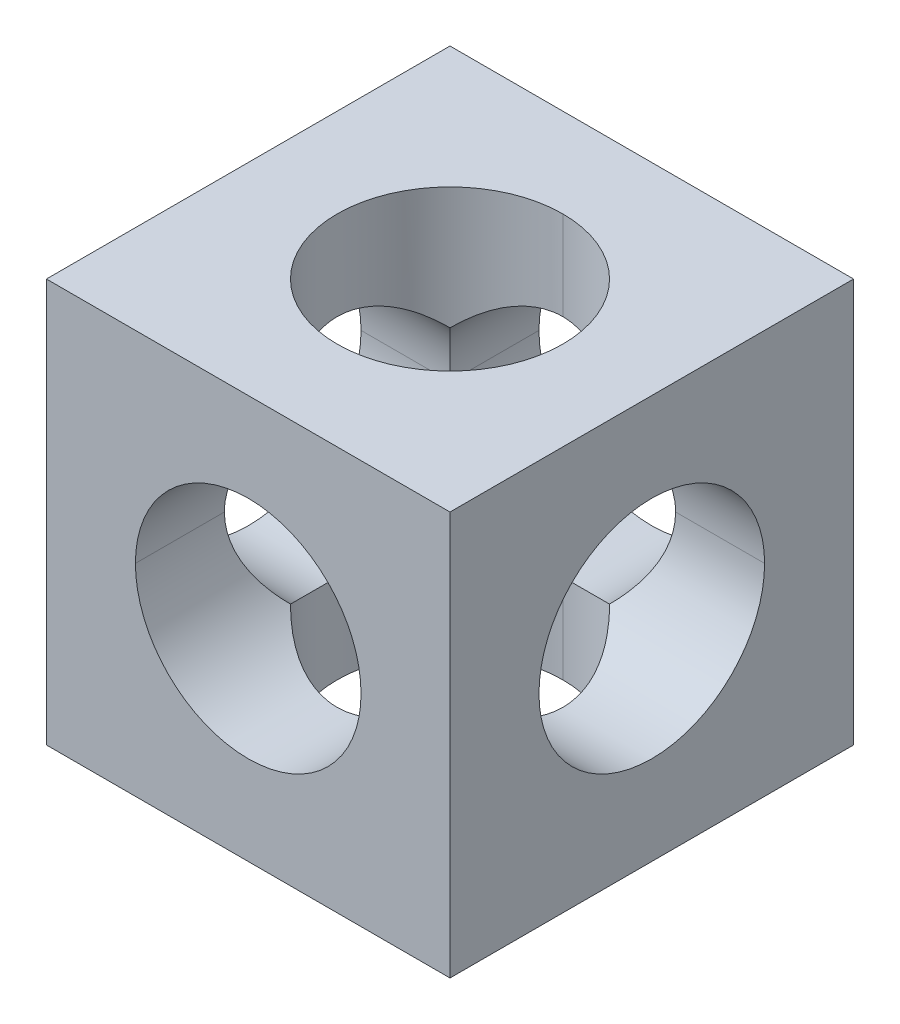
ISO-10303-21;
HEADER;
FILE_DESCRIPTION(('STEP AP214'),'2;1');
FILE_NAME('part.step','',(''),(''),'','','');
FILE_SCHEMA(('AUTOMOTIVE_DESIGN { 1 0 10303 214 1 1 1 1 }'));
ENDSEC;
DATA;
#1=APPLICATION_CONTEXT('core data for automotive mechanical design processes');
#2=APPLICATION_PROTOCOL_DEFINITION('international standard','automotive_design',2000,#1);
#3=PRODUCT_CONTEXT('',#1,'mechanical');
#4=PRODUCT('Part','Part','',(#3));
#5=PRODUCT_RELATED_PRODUCT_CATEGORY('part','',(#4));
#6=PRODUCT_DEFINITION_FORMATION('','',#4);
#7=PRODUCT_DEFINITION_CONTEXT('part definition',#1,'design');
#8=PRODUCT_DEFINITION('design','',#6,#7);
#9=PRODUCT_DEFINITION_SHAPE('','',#8);
#10=(LENGTH_UNIT() NAMED_UNIT(*) SI_UNIT(.MILLI.,.METRE.));
#11=(NAMED_UNIT(*) PLANE_ANGLE_UNIT() SI_UNIT($,.RADIAN.));
#12=(NAMED_UNIT(*) SI_UNIT($,.STERADIAN.) SOLID_ANGLE_UNIT());
#13=UNCERTAINTY_MEASURE_WITH_UNIT(LENGTH_MEASURE(1.E-05),#10,'distance_accuracy_value','');
#14=(GEOMETRIC_REPRESENTATION_CONTEXT(3) GLOBAL_UNCERTAINTY_ASSIGNED_CONTEXT((#13)) GLOBAL_UNIT_ASSIGNED_CONTEXT((#10,
#11,#12)) REPRESENTATION_CONTEXT('',''));
#15=CARTESIAN_POINT('',(0.,0.,0.));
#16=DIRECTION('',(0.,0.,1.));
#17=DIRECTION('',(1.,0.,0.));
#18=AXIS2_PLACEMENT_3D('',#15,#16,#17);
#19=CARTESIAN_POINT('',(6.35,6.35,-12.7));
#20=DIRECTION('',(0.,0.,1.));
#21=DIRECTION('',(1.,0.,0.));
#22=AXIS2_PLACEMENT_3D('',#19,#20,#21);
#23=CYLINDRICAL_SURFACE('',#22,3.55);
#24=DIRECTION('',(0.,0.,1.));
#25=VECTOR('',#24,1.);
#26=CARTESIAN_POINT('',(2.8,6.35,-12.7));
#27=LINE('',#26,#25);
#28=CARTESIAN_POINT('',(2.8,6.35,-2.8));
#29=VERTEX_POINT('',#28);
#30=CARTESIAN_POINT('',(2.8,6.35,0.));
#31=VERTEX_POINT('',#30);
#32=EDGE_CURVE('E241',#29,#31,#27,.T.);
#33=ORIENTED_EDGE('',*,*,#32,.F.);
#34=CARTESIAN_POINT('',(3.83977092678775,8.86022907321224,-3.83977092678775));
#35=CARTESIAN_POINT('',(3.16511899463641,8.18557714106089,-3.16511899463641));
#36=CARTESIAN_POINT('',(2.80000000000001,7.30410191232965,-2.80000000000001));
#37=CARTESIAN_POINT('',(2.8,6.35,-2.8));
#38=(BOUNDED_CURVE() B_SPLINE_CURVE(3,(#34,#35,#36,#37),.UNSPECIFIED.,.F.,
.F.) B_SPLINE_CURVE_WITH_KNOTS((4,4),(2.35619449019234,3.1415926535898),
.UNSPECIFIED.) CURVE() GEOMETRIC_REPRESENTATION_ITEM() RATIONAL_B_SPLINE_CURVE((1.,
0.949253021674191,0.949253021674191,1.)) REPRESENTATION_ITEM(''));
#39=CARTESIAN_POINT('',(3.83977092678775,8.86022907321224,-3.83977092678775));
#40=VERTEX_POINT('',#39);
#41=EDGE_CURVE('E10',#40,#29,#38,.T.);
#42=ORIENTED_EDGE('',*,*,#41,.F.);
#43=CARTESIAN_POINT('',(6.35,9.9,-2.8));
#44=CARTESIAN_POINT('',(5.39589808767035,9.9,-2.8));
#45=CARTESIAN_POINT('',(4.5144228589391,9.53488100536359,-3.16511899463641));
#46=CARTESIAN_POINT('',(3.83977092678775,8.86022907321224,-3.83977092678775));
#47=(BOUNDED_CURVE() B_SPLINE_CURVE(3,(#43,#44,#45,#46),.UNSPECIFIED.,.F.,
.F.) B_SPLINE_CURVE_WITH_KNOTS((4,4),(0.,0.785398163397449),
.UNSPECIFIED.) CURVE() GEOMETRIC_REPRESENTATION_ITEM() RATIONAL_B_SPLINE_CURVE((1.,
0.949253021674191,0.949253021674191,1.)) REPRESENTATION_ITEM(''));
#48=CARTESIAN_POINT('',(6.35,9.9,-2.8));
#49=VERTEX_POINT('',#48);
#50=EDGE_CURVE('E323',#49,#40,#47,.T.);
#51=ORIENTED_EDGE('',*,*,#50,.F.);
#52=CARTESIAN_POINT('',(8.86022907321224,8.86022907321224,-3.83977092678775));
#53=CARTESIAN_POINT('',(8.18557714106089,9.53488100536359,-3.1651189946364));
#54=CARTESIAN_POINT('',(7.30410191232965,9.9,-2.8));
#55=CARTESIAN_POINT('',(6.35,9.9,-2.8));
#56=(BOUNDED_CURVE() B_SPLINE_CURVE(3,(#52,#53,#54,#55),.UNSPECIFIED.,.F.,
.F.) B_SPLINE_CURVE_WITH_KNOTS((4,4),(5.49778714378214,6.28318530717959),
.UNSPECIFIED.) CURVE() GEOMETRIC_REPRESENTATION_ITEM() RATIONAL_B_SPLINE_CURVE((1.,
0.949253021674191,0.949253021674191,1.)) REPRESENTATION_ITEM(''));
#57=CARTESIAN_POINT('',(8.86022907321224,8.86022907321224,-3.83977092678775));
#58=VERTEX_POINT('',#57);
#59=EDGE_CURVE('E271',#58,#49,#56,.T.);
#60=ORIENTED_EDGE('',*,*,#59,.F.);
#61=CARTESIAN_POINT('',(9.9,6.35,-2.8));
#62=CARTESIAN_POINT('',(9.9,7.30410191232965,-2.80000000000001));
#63=CARTESIAN_POINT('',(9.53488100536359,8.18557714106089,-3.16511899463641));
#64=CARTESIAN_POINT('',(8.86022907321224,8.86022907321224,-3.83977092678775));
#65=(BOUNDED_CURVE() B_SPLINE_CURVE(3,(#61,#62,#63,#64),.UNSPECIFIED.,.F.,
.F.) B_SPLINE_CURVE_WITH_KNOTS((4,4),(0.,0.785398163397449),
.UNSPECIFIED.) CURVE() GEOMETRIC_REPRESENTATION_ITEM() RATIONAL_B_SPLINE_CURVE((1.,
0.949253021674191,0.949253021674191,1.)) REPRESENTATION_ITEM(''));
#66=CARTESIAN_POINT('',(9.9,6.35,-2.8));
#67=VERTEX_POINT('',#66);
#68=EDGE_CURVE('E281',#67,#58,#65,.T.);
#69=ORIENTED_EDGE('',*,*,#68,.F.);
#70=DIRECTION('',(0.,0.,1.));
#71=VECTOR('',#70,1.);
#72=CARTESIAN_POINT('',(9.9,6.35,-12.7));
#73=LINE('',#72,#71);
#74=CARTESIAN_POINT('',(9.9,6.35,0.));
#75=VERTEX_POINT('',#74);
#76=EDGE_CURVE('E389',#67,#75,#73,.T.);
#77=ORIENTED_EDGE('',*,*,#76,.T.);
#78=CARTESIAN_POINT('',(6.35,6.35,0.));
#79=DIRECTION('',(0.,0.,1.));
#80=DIRECTION('',(1.,0.,0.));
#81=AXIS2_PLACEMENT_3D('',#78,#79,#80);
#82=CIRCLE('',#81,3.55);
#83=EDGE_CURVE('E361',#75,#31,#82,.T.);
#84=ORIENTED_EDGE('',*,*,#83,.T.);
#85=EDGE_LOOP('',(#33,#42,#51,#60,#69,#77,#84));
#86=FACE_BOUND('',#85,.T.);
#87=ADVANCED_FACE('F15',(#86),#23,.F.);
#88=CARTESIAN_POINT('',(6.35,6.35,-12.7));
#89=DIRECTION('',(0.,0.,1.));
#90=DIRECTION('',(1.,0.,0.));
#91=AXIS2_PLACEMENT_3D('',#88,#89,#90);
#92=CYLINDRICAL_SURFACE('',#91,3.55);
#93=DIRECTION('',(0.,0.,1.));
#94=VECTOR('',#93,1.);
#95=CARTESIAN_POINT('',(2.8,6.35,-12.7));
#96=LINE('',#95,#94);
#97=CARTESIAN_POINT('',(2.8,6.35,-12.7));
#98=VERTEX_POINT('',#97);
#99=CARTESIAN_POINT('',(2.8,6.35,-9.9));
#100=VERTEX_POINT('',#99);
#101=EDGE_CURVE('E354',#98,#100,#96,.T.);
#102=ORIENTED_EDGE('',*,*,#101,.F.);
#103=CARTESIAN_POINT('',(6.35,6.35,-12.7));
#104=DIRECTION('',(0.,0.,1.));
#105=DIRECTION('',(1.,0.,0.));
#106=AXIS2_PLACEMENT_3D('',#103,#104,#105);
#107=CIRCLE('',#106,3.55);
#108=CARTESIAN_POINT('',(9.9,6.35,-12.7));
#109=VERTEX_POINT('',#108);
#110=EDGE_CURVE('E127',#109,#98,#107,.T.);
#111=ORIENTED_EDGE('',*,*,#110,.F.);
#112=DIRECTION('',(0.,0.,1.));
#113=VECTOR('',#112,1.);
#114=CARTESIAN_POINT('',(9.9,6.35,-12.7));
#115=LINE('',#114,#113);
#116=CARTESIAN_POINT('',(9.9,6.35,-9.9));
#117=VERTEX_POINT('',#116);
#118=EDGE_CURVE('E320',#109,#117,#115,.T.);
#119=ORIENTED_EDGE('',*,*,#118,.T.);
#120=CARTESIAN_POINT('',(8.86022907321224,8.86022907321224,-8.86022907321224));
#121=CARTESIAN_POINT('',(9.53488100536359,8.18557714106089,-9.53488100536359));
#122=CARTESIAN_POINT('',(9.9,7.30410191232965,-9.9));
#123=CARTESIAN_POINT('',(9.9,6.35,-9.9));
#124=(BOUNDED_CURVE() B_SPLINE_CURVE(3,(#120,#121,#122,#123),.UNSPECIFIED.,.F.,
.F.) B_SPLINE_CURVE_WITH_KNOTS((4,4),(5.49778714378214,6.28318530717959),
.UNSPECIFIED.) CURVE() GEOMETRIC_REPRESENTATION_ITEM() RATIONAL_B_SPLINE_CURVE((1.,
0.949253021674191,0.949253021674191,1.)) REPRESENTATION_ITEM(''));
#125=CARTESIAN_POINT('',(8.86022907321224,8.86022907321224,-8.86022907321224));
#126=VERTEX_POINT('',#125);
#127=EDGE_CURVE('E273',#126,#117,#124,.T.);
#128=ORIENTED_EDGE('',*,*,#127,.F.);
#129=CARTESIAN_POINT('',(6.35,9.9,-9.9));
#130=CARTESIAN_POINT('',(7.30410191232965,9.9,-9.9));
#131=CARTESIAN_POINT('',(8.18557714106089,9.53488100536359,-9.53488100536359));
#132=CARTESIAN_POINT('',(8.86022907321224,8.86022907321224,-8.86022907321224));
#133=(BOUNDED_CURVE() B_SPLINE_CURVE(3,(#129,#130,#131,#132),.UNSPECIFIED.,.F.,
.F.) B_SPLINE_CURVE_WITH_KNOTS((4,4),(0.,0.785398163397449),
.UNSPECIFIED.) CURVE() GEOMETRIC_REPRESENTATION_ITEM() RATIONAL_B_SPLINE_CURVE((1.,
0.949253021674191,0.949253021674191,1.)) REPRESENTATION_ITEM(''));
#134=CARTESIAN_POINT('',(6.35,9.9,-9.9));
#135=VERTEX_POINT('',#134);
#136=EDGE_CURVE('E272',#135,#126,#133,.T.);
#137=ORIENTED_EDGE('',*,*,#136,.F.);
#138=CARTESIAN_POINT('',(3.83977092678776,8.86022907321224,-8.86022907321225));
#139=CARTESIAN_POINT('',(4.51442285893911,9.53488100536359,-9.53488100536359));
#140=CARTESIAN_POINT('',(5.39589808767035,9.9,-9.9));
#141=CARTESIAN_POINT('',(6.35,9.9,-9.9));
#142=(BOUNDED_CURVE() B_SPLINE_CURVE(3,(#138,#139,#140,#141),.UNSPECIFIED.,.F.,
.F.) B_SPLINE_CURVE_WITH_KNOTS((4,4),(5.49778714378214,6.28318530717959),
.UNSPECIFIED.) CURVE() GEOMETRIC_REPRESENTATION_ITEM() RATIONAL_B_SPLINE_CURVE((1.,
0.949253021674191,0.949253021674191,1.)) REPRESENTATION_ITEM(''));
#143=CARTESIAN_POINT('',(3.83977092678776,8.86022907321224,-8.86022907321225));
#144=VERTEX_POINT('',#143);
#145=EDGE_CURVE('E295',#144,#135,#142,.T.);
#146=ORIENTED_EDGE('',*,*,#145,.F.);
#147=CARTESIAN_POINT('',(2.8,6.35,-9.9));
#148=CARTESIAN_POINT('',(2.80000000000001,7.30410191232965,-9.9));
#149=CARTESIAN_POINT('',(3.16511899463641,8.18557714106089,-9.53488100536359));
#150=CARTESIAN_POINT('',(3.83977092678776,8.86022907321224,-8.86022907321225));
#151=(BOUNDED_CURVE() B_SPLINE_CURVE(3,(#147,#148,#149,#150),.UNSPECIFIED.,.F.,
.F.) B_SPLINE_CURVE_WITH_KNOTS((4,4),(3.1415926535898,3.92699081698724),
.UNSPECIFIED.) CURVE() GEOMETRIC_REPRESENTATION_ITEM() RATIONAL_B_SPLINE_CURVE((1.,
0.949253021674191,0.949253021674191,1.)) REPRESENTATION_ITEM(''));
#152=EDGE_CURVE('E26',#100,#144,#151,.T.);
#153=ORIENTED_EDGE('',*,*,#152,.F.);
#154=EDGE_LOOP('',(#102,#111,#119,#128,#137,#146,#153));
#155=FACE_BOUND('',#154,.T.);
#156=ADVANCED_FACE('F17',(#155),#92,.F.);
#157=CARTESIAN_POINT('',(0.,6.35,-6.35));
#158=DIRECTION('',(1.,0.,0.));
#159=DIRECTION('',(0.,0.,-1.));
#160=AXIS2_PLACEMENT_3D('',#157,#158,#159);
#161=CYLINDRICAL_SURFACE('',#160,3.55);
#162=DIRECTION('',(1.,0.,0.));
#163=VECTOR('',#162,1.);
#164=CARTESIAN_POINT('',(0.,6.35,-2.8));
#165=LINE('',#164,#163);
#166=CARTESIAN_POINT('',(0.,6.35,-2.8));
#167=VERTEX_POINT('',#166);
#168=EDGE_CURVE('E223',#167,#29,#165,.T.);
#169=ORIENTED_EDGE('',*,*,#168,.F.);
#170=CARTESIAN_POINT('',(0.,6.35,-6.35));
#171=DIRECTION('',(1.,0.,0.));
#172=DIRECTION('',(0.,0.,-1.));
#173=AXIS2_PLACEMENT_3D('',#170,#171,#172);
#174=CIRCLE('',#173,3.55);
#175=CARTESIAN_POINT('',(0.,6.35,-9.9));
#176=VERTEX_POINT('',#175);
#177=EDGE_CURVE('E318',#176,#167,#174,.T.);
#178=ORIENTED_EDGE('',*,*,#177,.F.);
#179=DIRECTION('',(1.,0.,0.));
#180=VECTOR('',#179,1.);
#181=CARTESIAN_POINT('',(0.,6.35,-9.9));
#182=LINE('',#181,#180);
#183=EDGE_CURVE('E222',#176,#100,#182,.T.);
#184=ORIENTED_EDGE('',*,*,#183,.T.);
#185=ORIENTED_EDGE('',*,*,#152,.T.);
#186=CARTESIAN_POINT('',(3.83977092678775,8.86022907321224,-3.83977092678775));
#187=CARTESIAN_POINT('',(2.36931278036327,10.3306872196367,-5.31022907321224));
#188=CARTESIAN_POINT('',(2.36931278036327,10.3306872196367,-7.38977092678776));
#189=CARTESIAN_POINT('',(3.83977092678776,8.86022907321224,-8.86022907321225));
#190=(BOUNDED_CURVE() B_SPLINE_CURVE(3,(#186,#187,#188,#189),.UNSPECIFIED.,.F.,
.F.) B_SPLINE_CURVE_WITH_KNOTS((4,4),(5.49778714378214,7.06858347057704),
.UNSPECIFIED.) CURVE() GEOMETRIC_REPRESENTATION_ITEM() RATIONAL_B_SPLINE_CURVE((1.,
0.804737854124365,0.804737854124365,1.)) REPRESENTATION_ITEM(''));
#191=EDGE_CURVE('E329',#40,#144,#190,.T.);
#192=ORIENTED_EDGE('',*,*,#191,.F.);
#193=ORIENTED_EDGE('',*,*,#41,.T.);
#194=EDGE_LOOP('',(#169,#178,#184,#185,#192,#193));
#195=FACE_BOUND('',#194,.T.);
#196=ADVANCED_FACE('F525',(#195),#161,.F.);
#197=CARTESIAN_POINT('',(0.,6.35,-6.35));
#198=DIRECTION('',(1.,0.,0.));
#199=DIRECTION('',(0.,0.,-1.));
#200=AXIS2_PLACEMENT_3D('',#197,#198,#199);
#201=CYLINDRICAL_SURFACE('',#200,3.55);
#202=DIRECTION('',(1.,0.,0.));
#203=VECTOR('',#202,1.);
#204=CARTESIAN_POINT('',(0.,6.35,-2.8));
#205=LINE('',#204,#203);
#206=CARTESIAN_POINT('',(12.7,6.35,-2.8));
#207=VERTEX_POINT('',#206);
#208=EDGE_CURVE('E282',#67,#207,#205,.T.);
#209=ORIENTED_EDGE('',*,*,#208,.F.);
#210=ORIENTED_EDGE('',*,*,#68,.T.);
#211=CARTESIAN_POINT('',(8.86022907321224,8.86022907321224,-8.86022907321224));
#212=CARTESIAN_POINT('',(10.3306872196367,10.3306872196367,-7.38977092678776));
#213=CARTESIAN_POINT('',(10.3306872196367,10.3306872196367,-5.31022907321224));
#214=CARTESIAN_POINT('',(8.86022907321224,8.86022907321224,-3.83977092678775));
#215=(BOUNDED_CURVE() B_SPLINE_CURVE(3,(#211,#212,#213,#214),.UNSPECIFIED.,.F.,
.F.) B_SPLINE_CURVE_WITH_KNOTS((4,4),(5.49778714378214,7.06858347057704),
.UNSPECIFIED.) CURVE() GEOMETRIC_REPRESENTATION_ITEM() RATIONAL_B_SPLINE_CURVE((1.,
0.804737854124365,0.804737854124365,1.)) REPRESENTATION_ITEM(''));
#216=EDGE_CURVE('E262',#126,#58,#215,.T.);
#217=ORIENTED_EDGE('',*,*,#216,.F.);
#218=ORIENTED_EDGE('',*,*,#127,.T.);
#219=DIRECTION('',(1.,0.,0.));
#220=VECTOR('',#219,1.);
#221=CARTESIAN_POINT('',(0.,6.35,-9.9));
#222=LINE('',#221,#220);
#223=CARTESIAN_POINT('',(12.7,6.35,-9.9));
#224=VERTEX_POINT('',#223);
#225=EDGE_CURVE('E485',#117,#224,#222,.T.);
#226=ORIENTED_EDGE('',*,*,#225,.T.);
#227=CARTESIAN_POINT('',(12.7,6.35,-6.35));
#228=DIRECTION('',(1.,0.,0.));
#229=DIRECTION('',(0.,0.,-1.));
#230=AXIS2_PLACEMENT_3D('',#227,#228,#229);
#231=CIRCLE('',#230,3.55);
#232=EDGE_CURVE('E402',#224,#207,#231,.T.);
#233=ORIENTED_EDGE('',*,*,#232,.T.);
#234=EDGE_LOOP('',(#209,#210,#217,#218,#226,#233));
#235=FACE_BOUND('',#234,.T.);
#236=ADVANCED_FACE('F587',(#235),#201,.F.);
#237=CARTESIAN_POINT('',(6.35,0.,-6.35));
#238=DIRECTION('',(0.,1.,0.));
#239=DIRECTION('',(0.,0.,1.));
#240=AXIS2_PLACEMENT_3D('',#237,#238,#239);
#241=CYLINDRICAL_SURFACE('',#240,3.55);
#242=DIRECTION('',(0.,1.,0.));
#243=VECTOR('',#242,1.);
#244=CARTESIAN_POINT('',(6.35,0.,-9.9));
#245=LINE('',#244,#243);
#246=CARTESIAN_POINT('',(6.35,0.,-9.9));
#247=VERTEX_POINT('',#246);
#248=CARTESIAN_POINT('',(6.35,2.8,-9.9));
#249=VERTEX_POINT('',#248);
#250=EDGE_CURVE('E196',#247,#249,#245,.T.);
#251=ORIENTED_EDGE('',*,*,#250,.F.);
#252=CARTESIAN_POINT('',(6.35,0.,-6.35));
#253=DIRECTION('',(0.,1.,0.));
#254=DIRECTION('',(0.,0.,1.));
#255=AXIS2_PLACEMENT_3D('',#252,#253,#254);
#256=CIRCLE('',#255,3.55);
#257=CARTESIAN_POINT('',(6.35,0.,-2.8));
#258=VERTEX_POINT('',#257);
#259=EDGE_CURVE('E351',#258,#247,#256,.T.);
#260=ORIENTED_EDGE('',*,*,#259,.F.);
#261=DIRECTION('',(0.,1.,0.));
#262=VECTOR('',#261,1.);
#263=CARTESIAN_POINT('',(6.35,0.,-2.8));
#264=LINE('',#263,#262);
#265=CARTESIAN_POINT('',(6.35,2.8,-2.8));
#266=VERTEX_POINT('',#265);
#267=EDGE_CURVE('E117',#258,#266,#264,.T.);
#268=ORIENTED_EDGE('',*,*,#267,.T.);
#269=CARTESIAN_POINT('',(6.35,2.8,-2.8));
#270=CARTESIAN_POINT('',(7.30410191232965,2.80000000000001,-2.8));
#271=CARTESIAN_POINT('',(8.18557714106089,3.16511899463641,-3.1651189946364));
#272=CARTESIAN_POINT('',(8.86022907321224,3.83977092678776,-3.83977092678775));
#273=(BOUNDED_CURVE() B_SPLINE_CURVE(3,(#269,#270,#271,#272),.UNSPECIFIED.,.F.,
.F.) B_SPLINE_CURVE_WITH_KNOTS((4,4),(3.1415926535898,3.92699081698724),
.UNSPECIFIED.) CURVE() GEOMETRIC_REPRESENTATION_ITEM() RATIONAL_B_SPLINE_CURVE((1.,
0.949253021674191,0.949253021674191,1.)) REPRESENTATION_ITEM(''));
#274=CARTESIAN_POINT('',(8.86022907321224,3.83977092678776,-3.83977092678775));
#275=VERTEX_POINT('',#274);
#276=EDGE_CURVE('E231',#266,#275,#273,.T.);
#277=ORIENTED_EDGE('',*,*,#276,.T.);
#278=CARTESIAN_POINT('',(8.86022907321224,3.83977092678776,-3.83977092678775));
#279=CARTESIAN_POINT('',(10.3306872196367,2.36931278036328,-5.31022907321224));
#280=CARTESIAN_POINT('',(10.3306872196367,2.36931278036327,-7.38977092678776));
#281=CARTESIAN_POINT('',(8.86022907321224,3.83977092678776,-8.86022907321224));
#282=(BOUNDED_CURVE() B_SPLINE_CURVE(3,(#278,#279,#280,#281),.UNSPECIFIED.,.F.,
.F.) B_SPLINE_CURVE_WITH_KNOTS((4,4),(2.35619449019234,3.92699081698724),
.UNSPECIFIED.) CURVE() GEOMETRIC_REPRESENTATION_ITEM() RATIONAL_B_SPLINE_CURVE((1.,
0.804737854124365,0.804737854124365,1.)) REPRESENTATION_ITEM(''));
#283=CARTESIAN_POINT('',(8.86022907321224,3.83977092678776,-8.86022907321224));
#284=VERTEX_POINT('',#283);
#285=EDGE_CURVE('E186',#275,#284,#282,.T.);
#286=ORIENTED_EDGE('',*,*,#285,.T.);
#287=CARTESIAN_POINT('',(8.86022907321224,3.83977092678776,-8.86022907321224));
#288=CARTESIAN_POINT('',(8.18557714106089,3.16511899463641,-9.53488100536359));
#289=CARTESIAN_POINT('',(7.30410191232965,2.80000000000001,-9.9));
#290=CARTESIAN_POINT('',(6.35,2.8,-9.9));
#291=(BOUNDED_CURVE() B_SPLINE_CURVE(3,(#287,#288,#289,#290),.UNSPECIFIED.,.F.,
.F.) B_SPLINE_CURVE_WITH_KNOTS((4,4),(2.35619449019234,3.1415926535898),
.UNSPECIFIED.) CURVE() GEOMETRIC_REPRESENTATION_ITEM() RATIONAL_B_SPLINE_CURVE((1.,
0.949253021674191,0.949253021674191,1.)) REPRESENTATION_ITEM(''));
#292=EDGE_CURVE('E253',#284,#249,#291,.T.);
#293=ORIENTED_EDGE('',*,*,#292,.T.);
#294=EDGE_LOOP('',(#251,#260,#268,#277,#286,#293));
#295=FACE_BOUND('',#294,.T.);
#296=ADVANCED_FACE('F568',(#295),#241,.F.);
#297=CARTESIAN_POINT('',(0.,0.,0.));
#298=DIRECTION('',(0.,-1.,0.));
#299=DIRECTION('',(0.,0.,-1.));
#300=AXIS2_PLACEMENT_3D('',#297,#298,#299);
#301=PLANE('',#300);
#302=ORIENTED_EDGE('',*,*,#259,.T.);
#303=CARTESIAN_POINT('',(6.35,0.,-6.35));
#304=DIRECTION('',(0.,1.,0.));
#305=DIRECTION('',(0.,0.,1.));
#306=AXIS2_PLACEMENT_3D('',#303,#304,#305);
#307=CIRCLE('',#306,3.55);
#308=EDGE_CURVE('E19',#247,#258,#307,.T.);
#309=ORIENTED_EDGE('',*,*,#308,.T.);
#310=EDGE_LOOP('',(#302,#309));
#311=FACE_BOUND('',#310,.T.);
#312=DIRECTION('',(0.,0.,1.));
#313=VECTOR('',#312,1.);
#314=CARTESIAN_POINT('',(0.,0.,0.));
#315=LINE('',#314,#313);
#316=CARTESIAN_POINT('',(0.,0.,-12.7));
#317=VERTEX_POINT('',#316);
#318=CARTESIAN_POINT('',(0.,0.,0.));
#319=VERTEX_POINT('',#318);
#320=EDGE_CURVE('E400',#317,#319,#315,.T.);
#321=ORIENTED_EDGE('',*,*,#320,.F.);
#322=DIRECTION('',(-1.,0.,0.));
#323=VECTOR('',#322,1.);
#324=CARTESIAN_POINT('',(0.,0.,-12.7));
#325=LINE('',#324,#323);
#326=CARTESIAN_POINT('',(12.7,0.,-12.7));
#327=VERTEX_POINT('',#326);
#328=EDGE_CURVE('E348',#327,#317,#325,.T.);
#329=ORIENTED_EDGE('',*,*,#328,.F.);
#330=DIRECTION('',(0.,0.,-1.));
#331=VECTOR('',#330,1.);
#332=CARTESIAN_POINT('',(12.7,0.,0.));
#333=LINE('',#332,#331);
#334=CARTESIAN_POINT('',(12.7,0.,0.));
#335=VERTEX_POINT('',#334);
#336=EDGE_CURVE('E313',#335,#327,#333,.T.);
#337=ORIENTED_EDGE('',*,*,#336,.F.);
#338=DIRECTION('',(1.,0.,0.));
#339=VECTOR('',#338,1.);
#340=CARTESIAN_POINT('',(0.,0.,0.));
#341=LINE('',#340,#339);
#342=EDGE_CURVE('E420',#319,#335,#341,.T.);
#343=ORIENTED_EDGE('',*,*,#342,.F.);
#344=EDGE_LOOP('',(#321,#329,#337,#343));
#345=FACE_BOUND('',#344,.T.);
#346=ADVANCED_FACE('F543',(#311,#345),#301,.T.);
#347=CARTESIAN_POINT('',(0.,12.7,0.));
#348=DIRECTION('',(0.,-1.,0.));
#349=DIRECTION('',(0.,0.,-1.));
#350=AXIS2_PLACEMENT_3D('',#347,#348,#349);
#351=PLANE('',#350);
#352=CARTESIAN_POINT('',(6.35,12.7,-6.35));
#353=DIRECTION('',(0.,1.,0.));
#354=DIRECTION('',(0.,0.,1.));
#355=AXIS2_PLACEMENT_3D('',#352,#353,#354);
#356=CIRCLE('',#355,3.55);
#357=CARTESIAN_POINT('',(6.35,12.7,-2.8));
#358=VERTEX_POINT('',#357);
#359=CARTESIAN_POINT('',(6.35,12.7,-9.9));
#360=VERTEX_POINT('',#359);
#361=EDGE_CURVE('E303',#358,#360,#356,.T.);
#362=ORIENTED_EDGE('',*,*,#361,.F.);
#363=CARTESIAN_POINT('',(6.35,12.7,-6.35));
#364=DIRECTION('',(0.,1.,0.));
#365=DIRECTION('',(0.,0.,1.));
#366=AXIS2_PLACEMENT_3D('',#363,#364,#365);
#367=CIRCLE('',#366,3.55);
#368=EDGE_CURVE('E294',#360,#358,#367,.T.);
#369=ORIENTED_EDGE('',*,*,#368,.F.);
#370=EDGE_LOOP('',(#362,#369));
#371=FACE_BOUND('',#370,.T.);
#372=DIRECTION('',(0.,0.,1.));
#373=VECTOR('',#372,1.);
#374=CARTESIAN_POINT('',(0.,12.7,0.));
#375=LINE('',#374,#373);
#376=CARTESIAN_POINT('',(0.,12.7,-12.7));
#377=VERTEX_POINT('',#376);
#378=CARTESIAN_POINT('',(0.,12.7,0.));
#379=VERTEX_POINT('',#378);
#380=EDGE_CURVE('E319',#377,#379,#375,.T.);
#381=ORIENTED_EDGE('',*,*,#380,.T.);
#382=DIRECTION('',(1.,0.,0.));
#383=VECTOR('',#382,1.);
#384=CARTESIAN_POINT('',(0.,12.7,0.));
#385=LINE('',#384,#383);
#386=CARTESIAN_POINT('',(12.7,12.7,0.));
#387=VERTEX_POINT('',#386);
#388=EDGE_CURVE('E367',#379,#387,#385,.T.);
#389=ORIENTED_EDGE('',*,*,#388,.T.);
#390=DIRECTION('',(0.,0.,-1.));
#391=VECTOR('',#390,1.);
#392=CARTESIAN_POINT('',(12.7,12.7,0.));
#393=LINE('',#392,#391);
#394=CARTESIAN_POINT('',(12.7,12.7,-12.7));
#395=VERTEX_POINT('',#394);
#396=EDGE_CURVE('E312',#387,#395,#393,.T.);
#397=ORIENTED_EDGE('',*,*,#396,.T.);
#398=DIRECTION('',(-1.,0.,0.));
#399=VECTOR('',#398,1.);
#400=CARTESIAN_POINT('',(0.,12.7,-12.7));
#401=LINE('',#400,#399);
#402=EDGE_CURVE('E41',#395,#377,#401,.T.);
#403=ORIENTED_EDGE('',*,*,#402,.T.);
#404=EDGE_LOOP('',(#381,#389,#397,#403));
#405=FACE_BOUND('',#404,.T.);
#406=ADVANCED_FACE('F547',(#371,#405),#351,.F.);
#407=CARTESIAN_POINT('',(0.,12.7,-12.7));
#408=DIRECTION('',(0.,0.,1.));
#409=DIRECTION('',(1.,0.,0.));
#410=AXIS2_PLACEMENT_3D('',#407,#408,#409);
#411=PLANE('',#410);
#412=ORIENTED_EDGE('',*,*,#110,.T.);
#413=CARTESIAN_POINT('',(6.35,6.35,-12.7));
#414=DIRECTION('',(0.,0.,1.));
#415=DIRECTION('',(1.,0.,0.));
#416=AXIS2_PLACEMENT_3D('',#413,#414,#415);
#417=CIRCLE('',#416,3.55);
#418=EDGE_CURVE('E233',#98,#109,#417,.T.);
#419=ORIENTED_EDGE('',*,*,#418,.T.);
#420=EDGE_LOOP('',(#412,#419));
#421=FACE_BOUND('',#420,.T.);
#422=ORIENTED_EDGE('',*,*,#328,.T.);
#423=DIRECTION('',(0.,-1.,0.));
#424=VECTOR('',#423,1.);
#425=CARTESIAN_POINT('',(0.,12.7,-12.7));
#426=LINE('',#425,#424);
#427=EDGE_CURVE('E314',#377,#317,#426,.T.);
#428=ORIENTED_EDGE('',*,*,#427,.F.);
#429=ORIENTED_EDGE('',*,*,#402,.F.);
#430=DIRECTION('',(0.,-1.,0.));
#431=VECTOR('',#430,1.);
#432=CARTESIAN_POINT('',(12.7,12.7,-12.7));
#433=LINE('',#432,#431);
#434=EDGE_CURVE('E309',#395,#327,#433,.T.);
#435=ORIENTED_EDGE('',*,*,#434,.T.);
#436=EDGE_LOOP('',(#422,#428,#429,#435));
#437=FACE_BOUND('',#436,.T.);
#438=ADVANCED_FACE('F549',(#421,#437),#411,.F.);
#439=CARTESIAN_POINT('',(12.7,12.7,0.));
#440=DIRECTION('',(-1.,0.,0.));
#441=DIRECTION('',(0.,0.,1.));
#442=AXIS2_PLACEMENT_3D('',#439,#440,#441);
#443=PLANE('',#442);
#444=ORIENTED_EDGE('',*,*,#232,.F.);
#445=CARTESIAN_POINT('',(12.7,6.35,-6.35));
#446=DIRECTION('',(1.,0.,0.));
#447=DIRECTION('',(0.,0.,-1.));
#448=AXIS2_PLACEMENT_3D('',#445,#446,#447);
#449=CIRCLE('',#448,3.55);
#450=EDGE_CURVE('E289',#207,#224,#449,.T.);
#451=ORIENTED_EDGE('',*,*,#450,.F.);
#452=EDGE_LOOP('',(#444,#451));
#453=FACE_BOUND('',#452,.T.);
#454=ORIENTED_EDGE('',*,*,#336,.T.);
#455=ORIENTED_EDGE('',*,*,#434,.F.);
#456=ORIENTED_EDGE('',*,*,#396,.F.);
#457=DIRECTION('',(0.,-1.,0.));
#458=VECTOR('',#457,1.);
#459=CARTESIAN_POINT('',(12.7,12.7,0.));
#460=LINE('',#459,#458);
#461=EDGE_CURVE('E396',#387,#335,#460,.T.);
#462=ORIENTED_EDGE('',*,*,#461,.T.);
#463=EDGE_LOOP('',(#454,#455,#456,#462));
#464=FACE_BOUND('',#463,.T.);
#465=ADVANCED_FACE('F537',(#453,#464),#443,.F.);
#466=CARTESIAN_POINT('',(0.,12.7,0.));
#467=DIRECTION('',(0.,0.,-1.));
#468=DIRECTION('',(0.,-1.,0.));
#469=AXIS2_PLACEMENT_3D('',#466,#467,#468);
#470=PLANE('',#469);
#471=ORIENTED_EDGE('',*,*,#83,.F.);
#472=CARTESIAN_POINT('',(6.35,6.35,0.));
#473=DIRECTION('',(0.,0.,1.));
#474=DIRECTION('',(1.,0.,0.));
#475=AXIS2_PLACEMENT_3D('',#472,#473,#474);
#476=CIRCLE('',#475,3.55);
#477=EDGE_CURVE('E247',#31,#75,#476,.T.);
#478=ORIENTED_EDGE('',*,*,#477,.F.);
#479=EDGE_LOOP('',(#471,#478));
#480=FACE_BOUND('',#479,.T.);
#481=ORIENTED_EDGE('',*,*,#342,.T.);
#482=ORIENTED_EDGE('',*,*,#461,.F.);
#483=ORIENTED_EDGE('',*,*,#388,.F.);
#484=DIRECTION('',(0.,-1.,0.));
#485=VECTOR('',#484,1.);
#486=CARTESIAN_POINT('',(0.,12.7,0.));
#487=LINE('',#486,#485);
#488=EDGE_CURVE('E345',#379,#319,#487,.T.);
#489=ORIENTED_EDGE('',*,*,#488,.T.);
#490=EDGE_LOOP('',(#481,#482,#483,#489));
#491=FACE_BOUND('',#490,.T.);
#492=ADVANCED_FACE('F534',(#480,#491),#470,.F.);
#493=CARTESIAN_POINT('',(0.,12.7,0.));
#494=DIRECTION('',(1.,0.,0.));
#495=DIRECTION('',(0.,1.,0.));
#496=AXIS2_PLACEMENT_3D('',#493,#494,#495);
#497=PLANE('',#496);
#498=ORIENTED_EDGE('',*,*,#177,.T.);
#499=CARTESIAN_POINT('',(0.,6.35,-6.35));
#500=DIRECTION('',(1.,0.,0.));
#501=DIRECTION('',(0.,0.,-1.));
#502=AXIS2_PLACEMENT_3D('',#499,#500,#501);
#503=CIRCLE('',#502,3.55);
#504=EDGE_CURVE('E298',#167,#176,#503,.T.);
#505=ORIENTED_EDGE('',*,*,#504,.T.);
#506=EDGE_LOOP('',(#498,#505));
#507=FACE_BOUND('',#506,.T.);
#508=ORIENTED_EDGE('',*,*,#320,.T.);
#509=ORIENTED_EDGE('',*,*,#488,.F.);
#510=ORIENTED_EDGE('',*,*,#380,.F.);
#511=ORIENTED_EDGE('',*,*,#427,.T.);
#512=EDGE_LOOP('',(#508,#509,#510,#511));
#513=FACE_BOUND('',#512,.T.);
#514=ADVANCED_FACE('F528',(#507,#513),#497,.F.);
#515=CARTESIAN_POINT('',(6.35,0.,-6.35));
#516=DIRECTION('',(0.,1.,0.));
#517=DIRECTION('',(0.,0.,1.));
#518=AXIS2_PLACEMENT_3D('',#515,#516,#517);
#519=CYLINDRICAL_SURFACE('',#518,3.55);
#520=DIRECTION('',(0.,1.,0.));
#521=VECTOR('',#520,1.);
#522=CARTESIAN_POINT('',(6.35,0.,-9.9));
#523=LINE('',#522,#521);
#524=EDGE_CURVE('E290',#135,#360,#523,.T.);
#525=ORIENTED_EDGE('',*,*,#524,.F.);
#526=ORIENTED_EDGE('',*,*,#136,.T.);
#527=ORIENTED_EDGE('',*,*,#216,.T.);
#528=ORIENTED_EDGE('',*,*,#59,.T.);
#529=DIRECTION('',(0.,1.,0.));
#530=VECTOR('',#529,1.);
#531=CARTESIAN_POINT('',(6.35,0.,-2.8));
#532=LINE('',#531,#530);
#533=EDGE_CURVE('E330',#49,#358,#532,.T.);
#534=ORIENTED_EDGE('',*,*,#533,.T.);
#535=ORIENTED_EDGE('',*,*,#361,.T.);
#536=EDGE_LOOP('',(#525,#526,#527,#528,#534,#535));
#537=FACE_BOUND('',#536,.T.);
#538=ADVANCED_FACE('F569',(#537),#519,.F.);
#539=CARTESIAN_POINT('',(6.35,0.,-6.35));
#540=DIRECTION('',(0.,1.,0.));
#541=DIRECTION('',(0.,0.,1.));
#542=AXIS2_PLACEMENT_3D('',#539,#540,#541);
#543=CYLINDRICAL_SURFACE('',#542,3.55);
#544=ORIENTED_EDGE('',*,*,#145,.T.);
#545=ORIENTED_EDGE('',*,*,#524,.T.);
#546=ORIENTED_EDGE('',*,*,#368,.T.);
#547=ORIENTED_EDGE('',*,*,#533,.F.);
#548=ORIENTED_EDGE('',*,*,#50,.T.);
#549=ORIENTED_EDGE('',*,*,#191,.T.);
#550=EDGE_LOOP('',(#544,#545,#546,#547,#548,#549));
#551=FACE_BOUND('',#550,.T.);
#552=ADVANCED_FACE('F571',(#551),#543,.F.);
#553=CARTESIAN_POINT('',(6.35,0.,-6.35));
#554=DIRECTION('',(0.,1.,0.));
#555=DIRECTION('',(0.,0.,1.));
#556=AXIS2_PLACEMENT_3D('',#553,#554,#555);
#557=CYLINDRICAL_SURFACE('',#556,3.55);
#558=ORIENTED_EDGE('',*,*,#308,.F.);
#559=ORIENTED_EDGE('',*,*,#250,.T.);
#560=CARTESIAN_POINT('',(6.35,2.8,-9.9));
#561=CARTESIAN_POINT('',(5.39589808767035,2.80000000000001,-9.9));
#562=CARTESIAN_POINT('',(4.51442285893911,3.16511899463641,-9.53488100536359));
#563=CARTESIAN_POINT('',(3.83977092678776,3.83977092678776,-8.86022907321225));
#564=(BOUNDED_CURVE() B_SPLINE_CURVE(3,(#560,#561,#562,#563),.UNSPECIFIED.,.F.,
.F.) B_SPLINE_CURVE_WITH_KNOTS((4,4),(3.1415926535898,3.92699081698724),
.UNSPECIFIED.) CURVE() GEOMETRIC_REPRESENTATION_ITEM() RATIONAL_B_SPLINE_CURVE((1.,
0.949253021674191,0.949253021674191,1.)) REPRESENTATION_ITEM(''));
#565=CARTESIAN_POINT('',(3.83977092678776,3.83977092678776,-8.86022907321225));
#566=VERTEX_POINT('',#565);
#567=EDGE_CURVE('E219',#249,#566,#564,.T.);
#568=ORIENTED_EDGE('',*,*,#567,.T.);
#569=CARTESIAN_POINT('',(3.83977092678776,3.83977092678776,-8.86022907321225));
#570=CARTESIAN_POINT('',(2.36931278036327,2.36931278036327,-7.38977092678776));
#571=CARTESIAN_POINT('',(2.36931278036326,2.36931278036327,-5.31022907321224));
#572=CARTESIAN_POINT('',(3.83977092678775,3.83977092678776,-3.83977092678775));
#573=(BOUNDED_CURVE() B_SPLINE_CURVE(3,(#569,#570,#571,#572),.UNSPECIFIED.,.F.,
.F.) B_SPLINE_CURVE_WITH_KNOTS((4,4),(2.35619449019234,3.92699081698724),
.UNSPECIFIED.) CURVE() GEOMETRIC_REPRESENTATION_ITEM() RATIONAL_B_SPLINE_CURVE((1.,
0.804737854124365,0.804737854124365,1.)) REPRESENTATION_ITEM(''));
#574=CARTESIAN_POINT('',(3.83977092678775,3.83977092678776,-3.83977092678775));
#575=VERTEX_POINT('',#574);
#576=EDGE_CURVE('E205',#566,#575,#573,.T.);
#577=ORIENTED_EDGE('',*,*,#576,.T.);
#578=CARTESIAN_POINT('',(3.83977092678775,3.83977092678776,-3.83977092678775));
#579=CARTESIAN_POINT('',(4.5144228589391,3.16511899463641,-3.16511899463641));
#580=CARTESIAN_POINT('',(5.39589808767035,2.80000000000001,-2.8));
#581=CARTESIAN_POINT('',(6.35,2.8,-2.8));
#582=(BOUNDED_CURVE() B_SPLINE_CURVE(3,(#578,#579,#580,#581),.UNSPECIFIED.,.F.,
.F.) B_SPLINE_CURVE_WITH_KNOTS((4,4),(2.35619449019234,3.1415926535898),
.UNSPECIFIED.) CURVE() GEOMETRIC_REPRESENTATION_ITEM() RATIONAL_B_SPLINE_CURVE((1.,
0.949253021674191,0.949253021674191,1.)) REPRESENTATION_ITEM(''));
#583=EDGE_CURVE('E216',#575,#266,#582,.T.);
#584=ORIENTED_EDGE('',*,*,#583,.T.);
#585=ORIENTED_EDGE('',*,*,#267,.F.);
#586=EDGE_LOOP('',(#558,#559,#568,#577,#584,#585));
#587=FACE_BOUND('',#586,.T.);
#588=ADVANCED_FACE('F215',(#587),#557,.F.);
#589=CARTESIAN_POINT('',(0.,6.35,-6.35));
#590=DIRECTION('',(1.,0.,0.));
#591=DIRECTION('',(0.,0.,-1.));
#592=AXIS2_PLACEMENT_3D('',#589,#590,#591);
#593=CYLINDRICAL_SURFACE('',#592,3.55);
#594=CARTESIAN_POINT('',(8.86022907321224,3.83977092678776,-3.83977092678775));
#595=CARTESIAN_POINT('',(9.53488100536359,4.51442285893911,-3.16511899463641));
#596=CARTESIAN_POINT('',(9.9,5.39589808767035,-2.80000000000001));
#597=CARTESIAN_POINT('',(9.9,6.35,-2.8));
#598=(BOUNDED_CURVE() B_SPLINE_CURVE(3,(#594,#595,#596,#597),.UNSPECIFIED.,.F.,
.F.) B_SPLINE_CURVE_WITH_KNOTS((4,4),(5.49778714378214,6.28318530717959),
.UNSPECIFIED.) CURVE() GEOMETRIC_REPRESENTATION_ITEM() RATIONAL_B_SPLINE_CURVE((1.,
0.949253021674191,0.949253021674191,1.)) REPRESENTATION_ITEM(''));
#599=EDGE_CURVE('E380',#275,#67,#598,.T.);
#600=ORIENTED_EDGE('',*,*,#599,.T.);
#601=ORIENTED_EDGE('',*,*,#208,.T.);
#602=ORIENTED_EDGE('',*,*,#450,.T.);
#603=ORIENTED_EDGE('',*,*,#225,.F.);
#604=CARTESIAN_POINT('',(9.9,6.35,-9.9));
#605=CARTESIAN_POINT('',(9.9,5.39589808767035,-9.9));
#606=CARTESIAN_POINT('',(9.53488100536359,4.5144228589391,-9.53488100536359));
#607=CARTESIAN_POINT('',(8.86022907321224,3.83977092678776,-8.86022907321224));
#608=(BOUNDED_CURVE() B_SPLINE_CURVE(3,(#604,#605,#606,#607),.UNSPECIFIED.,.F.,
.F.) B_SPLINE_CURVE_WITH_KNOTS((4,4),(0.,0.785398163397449),
.UNSPECIFIED.) CURVE() GEOMETRIC_REPRESENTATION_ITEM() RATIONAL_B_SPLINE_CURVE((1.,
0.949253021674191,0.949253021674191,1.)) REPRESENTATION_ITEM(''));
#609=EDGE_CURVE('E261',#117,#284,#608,.T.);
#610=ORIENTED_EDGE('',*,*,#609,.T.);
#611=ORIENTED_EDGE('',*,*,#285,.F.);
#612=EDGE_LOOP('',(#600,#601,#602,#603,#610,#611));
#613=FACE_BOUND('',#612,.T.);
#614=ADVANCED_FACE('F590',(#613),#593,.F.);
#615=CARTESIAN_POINT('',(0.,6.35,-6.35));
#616=DIRECTION('',(1.,0.,0.));
#617=DIRECTION('',(0.,0.,-1.));
#618=AXIS2_PLACEMENT_3D('',#615,#616,#617);
#619=CYLINDRICAL_SURFACE('',#618,3.55);
#620=ORIENTED_EDGE('',*,*,#504,.F.);
#621=ORIENTED_EDGE('',*,*,#168,.T.);
#622=CARTESIAN_POINT('',(2.8,6.35,-2.8));
#623=CARTESIAN_POINT('',(2.80000000000001,5.39589808767035,-2.80000000000001));
#624=CARTESIAN_POINT('',(3.16511899463641,4.51442285893911,-3.16511899463641));
#625=CARTESIAN_POINT('',(3.83977092678775,3.83977092678776,-3.83977092678775));
#626=(BOUNDED_CURVE() B_SPLINE_CURVE(3,(#622,#623,#624,#625),.UNSPECIFIED.,.F.,
.F.) B_SPLINE_CURVE_WITH_KNOTS((4,4),(3.1415926535898,3.92699081698724),
.UNSPECIFIED.) CURVE() GEOMETRIC_REPRESENTATION_ITEM() RATIONAL_B_SPLINE_CURVE((1.,
0.949253021674191,0.949253021674191,1.)) REPRESENTATION_ITEM(''));
#627=EDGE_CURVE('E229',#29,#575,#626,.T.);
#628=ORIENTED_EDGE('',*,*,#627,.T.);
#629=ORIENTED_EDGE('',*,*,#576,.F.);
#630=CARTESIAN_POINT('',(3.83977092678776,3.83977092678776,-8.86022907321225));
#631=CARTESIAN_POINT('',(3.16511899463641,4.51442285893911,-9.53488100536359));
#632=CARTESIAN_POINT('',(2.80000000000001,5.39589808767035,-9.9));
#633=CARTESIAN_POINT('',(2.8,6.35,-9.9));
#634=(BOUNDED_CURVE() B_SPLINE_CURVE(3,(#630,#631,#632,#633),.UNSPECIFIED.,.F.,
.F.) B_SPLINE_CURVE_WITH_KNOTS((4,4),(2.35619449019234,3.1415926535898),
.UNSPECIFIED.) CURVE() GEOMETRIC_REPRESENTATION_ITEM() RATIONAL_B_SPLINE_CURVE((1.,
0.949253021674191,0.949253021674191,1.)) REPRESENTATION_ITEM(''));
#635=EDGE_CURVE('E372',#566,#100,#634,.T.);
#636=ORIENTED_EDGE('',*,*,#635,.T.);
#637=ORIENTED_EDGE('',*,*,#183,.F.);
#638=EDGE_LOOP('',(#620,#621,#628,#629,#636,#637));
#639=FACE_BOUND('',#638,.T.);
#640=ADVANCED_FACE('F237',(#639),#619,.F.);
#641=CARTESIAN_POINT('',(6.35,6.35,-12.7));
#642=DIRECTION('',(0.,0.,1.));
#643=DIRECTION('',(1.,0.,0.));
#644=AXIS2_PLACEMENT_3D('',#641,#642,#643);
#645=CYLINDRICAL_SURFACE('',#644,3.55);
#646=ORIENTED_EDGE('',*,*,#418,.F.);
#647=ORIENTED_EDGE('',*,*,#101,.T.);
#648=ORIENTED_EDGE('',*,*,#635,.F.);
#649=ORIENTED_EDGE('',*,*,#567,.F.);
#650=ORIENTED_EDGE('',*,*,#292,.F.);
#651=ORIENTED_EDGE('',*,*,#609,.F.);
#652=ORIENTED_EDGE('',*,*,#118,.F.);
#653=EDGE_LOOP('',(#646,#647,#648,#649,#650,#651,#652));
#654=FACE_BOUND('',#653,.T.);
#655=ADVANCED_FACE('F614',(#654),#645,.F.);
#656=CARTESIAN_POINT('',(6.35,6.35,-12.7));
#657=DIRECTION('',(0.,0.,1.));
#658=DIRECTION('',(1.,0.,0.));
#659=AXIS2_PLACEMENT_3D('',#656,#657,#658);
#660=CYLINDRICAL_SURFACE('',#659,3.55);
#661=ORIENTED_EDGE('',*,*,#627,.F.);
#662=ORIENTED_EDGE('',*,*,#32,.T.);
#663=ORIENTED_EDGE('',*,*,#477,.T.);
#664=ORIENTED_EDGE('',*,*,#76,.F.);
#665=ORIENTED_EDGE('',*,*,#599,.F.);
#666=ORIENTED_EDGE('',*,*,#276,.F.);
#667=ORIENTED_EDGE('',*,*,#583,.F.);
#668=EDGE_LOOP('',(#661,#662,#663,#664,#665,#666,#667));
#669=FACE_BOUND('',#668,.T.);
#670=ADVANCED_FACE('F227',(#669),#660,.F.);
#671=CLOSED_SHELL('',(#87,#156,#196,#236,#296,#346,#406,#438,#465,#492,#514,#538,#552,#588,#614,
#640,#655,#670));
#672=MANIFOLD_SOLID_BREP('B1',#671);
#673=ADVANCED_BREP_SHAPE_REPRESENTATION('',(#18,#672),#14);
#674=SHAPE_DEFINITION_REPRESENTATION(#9,#673);
ENDSEC;
END-ISO-10303-21;
